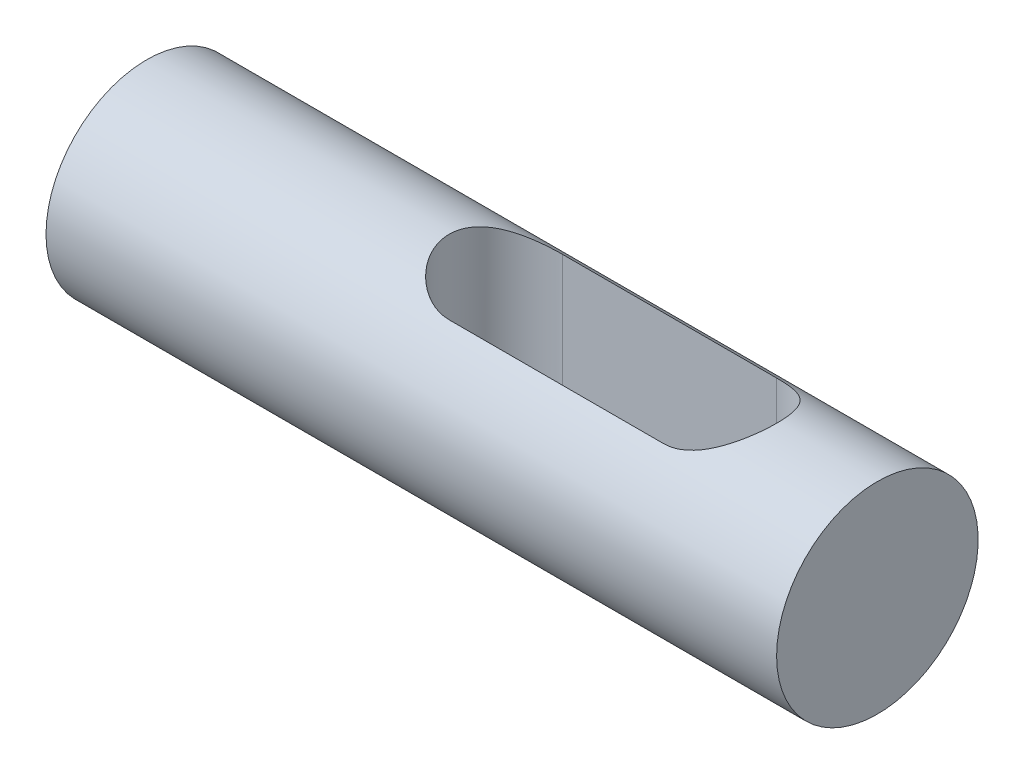
ISO-10303-21;
HEADER;
FILE_DESCRIPTION(('STEP AP214'),'2;1');
FILE_NAME('part.step','',(''),(''),'','','');
FILE_SCHEMA(('AUTOMOTIVE_DESIGN { 1 0 10303 214 1 1 1 1 }'));
ENDSEC;
DATA;
#1=APPLICATION_CONTEXT('core data for automotive mechanical design processes');
#2=APPLICATION_PROTOCOL_DEFINITION('international standard','automotive_design',2000,#1);
#3=PRODUCT_CONTEXT('',#1,'mechanical');
#4=PRODUCT('Part','Part','',(#3));
#5=PRODUCT_RELATED_PRODUCT_CATEGORY('part','',(#4));
#6=PRODUCT_DEFINITION_FORMATION('','',#4);
#7=PRODUCT_DEFINITION_CONTEXT('part definition',#1,'design');
#8=PRODUCT_DEFINITION('design','',#6,#7);
#9=PRODUCT_DEFINITION_SHAPE('','',#8);
#10=(LENGTH_UNIT() NAMED_UNIT(*) SI_UNIT(.MILLI.,.METRE.));
#11=(NAMED_UNIT(*) PLANE_ANGLE_UNIT() SI_UNIT($,.RADIAN.));
#12=(NAMED_UNIT(*) SI_UNIT($,.STERADIAN.) SOLID_ANGLE_UNIT());
#13=UNCERTAINTY_MEASURE_WITH_UNIT(LENGTH_MEASURE(1.E-05),#10,'distance_accuracy_value','');
#14=(GEOMETRIC_REPRESENTATION_CONTEXT(3) GLOBAL_UNCERTAINTY_ASSIGNED_CONTEXT((#13)) GLOBAL_UNIT_ASSIGNED_CONTEXT((#10,
#11,#12)) REPRESENTATION_CONTEXT('',''));
#15=CARTESIAN_POINT('',(0.,0.,0.));
#16=DIRECTION('',(0.,0.,1.));
#17=DIRECTION('',(1.,0.,0.));
#18=AXIS2_PLACEMENT_3D('',#15,#16,#17);
#19=CARTESIAN_POINT('',(-7.25,0.,-2.));
#20=DIRECTION('',(1.,0.,0.));
#21=DIRECTION('',(0.,0.,-1.));
#22=AXIS2_PLACEMENT_3D('',#19,#20,#21);
#23=PLANE('',#22);
#24=CARTESIAN_POINT('',(-7.25,0.,0.));
#25=DIRECTION('',(-1.,0.,0.));
#26=DIRECTION('',(0.,0.,1.));
#27=AXIS2_PLACEMENT_3D('',#24,#25,#26);
#28=CIRCLE('',#27,2.);
#29=CARTESIAN_POINT('',(-7.25,0.,2.));
#30=VERTEX_POINT('',#29);
#31=EDGE_CURVE('E102',#30,#30,#28,.T.);
#32=ORIENTED_EDGE('',*,*,#31,.T.);
#33=EDGE_LOOP('',(#32));
#34=FACE_BOUND('',#33,.T.);
#35=ADVANCED_FACE('F39',(#34),#23,.F.);
#36=CARTESIAN_POINT('',(7.25,0.,-2.));
#37=DIRECTION('',(-1.,0.,0.));
#38=DIRECTION('',(0.,0.,1.));
#39=AXIS2_PLACEMENT_3D('',#36,#37,#38);
#40=PLANE('',#39);
#41=CARTESIAN_POINT('',(7.25,0.,0.));
#42=DIRECTION('',(-1.,0.,0.));
#43=DIRECTION('',(0.,0.,1.));
#44=AXIS2_PLACEMENT_3D('',#41,#42,#43);
#45=CIRCLE('',#44,2.);
#46=CARTESIAN_POINT('',(7.25,0.,2.));
#47=VERTEX_POINT('',#46);
#48=EDGE_CURVE('E98',#47,#47,#45,.T.);
#49=ORIENTED_EDGE('',*,*,#48,.F.);
#50=EDGE_LOOP('',(#49));
#51=FACE_BOUND('',#50,.T.);
#52=ADVANCED_FACE('F146',(#51),#40,.F.);
#53=CARTESIAN_POINT('',(-7.25,0.,0.));
#54=DIRECTION('',(-1.,0.,0.));
#55=DIRECTION('',(0.,0.,1.));
#56=AXIS2_PLACEMENT_3D('',#53,#54,#55);
#57=CYLINDRICAL_SURFACE('',#56,2.);
#58=DIRECTION('',(-1.,0.,0.));
#59=VECTOR('',#58,1.);
#60=CARTESIAN_POINT('',(-7.25,-1.65359456941537,1.125));
#61=LINE('',#60,#59);
#62=CARTESIAN_POINT('',(-0.125000000000001,-1.65359456941537,1.125));
#63=VERTEX_POINT('',#62);
#64=CARTESIAN_POINT('',(4.125,-1.65359456941537,1.125));
#65=VERTEX_POINT('',#64);
#66=EDGE_CURVE('E11',#63,#65,#61,.F.);
#67=ORIENTED_EDGE('',*,*,#66,.T.);
#68=CARTESIAN_POINT('',(4.125,-1.65359456941537,1.125));
#69=CARTESIAN_POINT('',(4.15386389570559,-1.65358711538158,1.12500287836741));
#70=CARTESIAN_POINT('',(4.18271026785527,-1.65435122032378,1.12388845882558));
#71=CARTESIAN_POINT('',(4.24013379992399,-1.65735152559333,1.11946281329818));
#72=CARTESIAN_POINT('',(4.26871116102577,-1.65958651945046,1.11615338770954));
#73=CARTESIAN_POINT('',(4.35331043182428,-1.6683468674762,1.10305603715231));
#74=CARTESIAN_POINT('',(4.40866363768011,-1.67692987515379,1.0900976447495));
#75=CARTESIAN_POINT('',(4.51582344307037,-1.698337951532,1.05642678896663));
#76=CARTESIAN_POINT('',(4.56763974386999,-1.71115080346554,1.03573663425074));
#77=CARTESIAN_POINT('',(4.66714499252839,-1.73954491806023,0.987305391097616));
#78=CARTESIAN_POINT('',(4.7148254994319,-1.7551316531166,0.959550317340254));
#79=CARTESIAN_POINT('',(4.81011548124933,-1.78929411228828,0.894380380741773));
#80=CARTESIAN_POINT('',(4.8571887113898,-1.80801174752583,0.856256062935797));
#81=CARTESIAN_POINT('',(4.94469617247539,-1.84518502966431,0.772901175612199));
#82=CARTESIAN_POINT('',(4.98512824283417,-1.8636405895267,0.727668302777425));
#83=CARTESIAN_POINT('',(5.06185527330172,-1.90021925704792,0.626355454791834));
#84=CARTESIAN_POINT('',(5.09743693517986,-1.91815863765017,0.569662512765784));
#85=CARTESIAN_POINT('',(5.15830643510674,-1.94972275541321,0.449893051164455));
#86=CARTESIAN_POINT('',(5.18360219947783,-1.96335081307874,0.386821493939291));
#87=CARTESIAN_POINT('',(5.22087484964285,-1.983707483721,0.261841154752704));
#88=CARTESIAN_POINT('',(5.23381225144723,-1.99092976310293,0.200301211044951));
#89=CARTESIAN_POINT('',(5.2492153625028,-1.99954794380485,0.0755387572435754));
#90=CARTESIAN_POINT('',(5.25168933581894,-2.00094844317905,0.0123176146996819));
#91=CARTESIAN_POINT('',(5.24634573901463,-1.99794650648411,-0.106573644593671));
#92=CARTESIAN_POINT('',(5.23962433568443,-1.9941620829804,-0.16231326660962));
#93=CARTESIAN_POINT('',(5.218115786903,-1.98222024885811,-0.271718473247412));
#94=CARTESIAN_POINT('',(5.20332813985648,-1.97406256629116,-0.325383928665992));
#95=CARTESIAN_POINT('',(5.16613765736499,-1.95399487456054,-0.429841252362607));
#96=CARTESIAN_POINT('',(5.14366221460192,-1.94204917096166,-0.480600127271722));
#97=CARTESIAN_POINT('',(5.09190207949874,-1.91540667029966,-0.577716666433138));
#98=CARTESIAN_POINT('',(5.06261532716285,-1.90070904121361,-0.624072993204179));
#99=CARTESIAN_POINT('',(4.99437674105676,-1.86793927615096,-0.716567233240053));
#100=CARTESIAN_POINT('',(4.95471348834761,-1.84967367969735,-0.762111612248061));
#101=CARTESIAN_POINT('',(4.86869299929254,-1.81271733895772,-0.846270194651875));
#102=CARTESIAN_POINT('',(4.82232695078998,-1.79402606271729,-0.884875122483921));
#103=CARTESIAN_POINT('',(4.71892944275544,-1.75630121518769,-0.957729032831986));
#104=CARTESIAN_POINT('',(4.66130254430552,-1.73740500124644,-0.991211472146748));
#105=CARTESIAN_POINT('',(4.54010777305908,-1.7039147244886,-1.04773887480402));
#106=CARTESIAN_POINT('',(4.47655860496576,-1.68930768352114,-1.0708154400995));
#107=CARTESIAN_POINT('',(4.36480856074422,-1.67028013150757,-1.100174536906));
#108=CARTESIAN_POINT('',(4.31767277527658,-1.66412149730692,-1.10941178532545));
#109=CARTESIAN_POINT('',(4.22205715091862,-1.65573434723787,-1.12185619841346));
#110=CARTESIAN_POINT('',(4.17357212449972,-1.65352405019902,-1.12503541394649));
#111=CARTESIAN_POINT('',(4.125,-1.65359456941537,-1.125));
#112=B_SPLINE_CURVE_WITH_KNOTS('',3,(#68,#69,#70,#71,#72,#73,#74,#75,#76,#77,#78,#79,#80,#81,
#82,#83,#84,#85,#86,#87,#88,#89,#90,#91,#92,#93,#94,#95,#96,#97,#98,#99,#100,#101,#102,#103,
#104,#105,#106,#107,#108,#109,#110,#111),.UNSPECIFIED.,.F.,.F.,(4,2,2,2,2,2,2,2,2,2,2,2,2,2,2,2,
2,2,2,2,2,4),(0.,0.08652719230841,0.172983500548472,0.344524638880623,0.515574599230706,
0.686965830140966,0.876405902523249,1.06590748440291,1.27268671214241,1.47930629225317,
1.66810632929641,1.85675722330539,2.02477200534607,2.1927972364922,2.36245532435152,
2.53216479006594,2.72068185125432,2.90944904838971,3.11621878001185,3.32235626520317,
3.46710633524031,3.61252261753081),.UNSPECIFIED.);
#113=CARTESIAN_POINT('',(4.125,-1.65359456941537,-1.125));
#114=VERTEX_POINT('',#113);
#115=EDGE_CURVE('E53',#65,#114,#112,.T.);
#116=ORIENTED_EDGE('',*,*,#115,.T.);
#117=DIRECTION('',(-1.,0.,0.));
#118=VECTOR('',#117,1.);
#119=CARTESIAN_POINT('',(-7.25,-1.65359456941537,-1.125));
#120=LINE('',#119,#118);
#121=CARTESIAN_POINT('',(-0.125000000000001,-1.65359456941537,-1.125));
#122=VERTEX_POINT('',#121);
#123=EDGE_CURVE('E130',#114,#122,#120,.T.);
#124=ORIENTED_EDGE('',*,*,#123,.T.);
#125=CARTESIAN_POINT('',(-0.125000000000001,-1.65359456941537,-1.125));
#126=CARTESIAN_POINT('',(-0.153863895705595,-1.65358711538158,-1.12500287836741));
#127=CARTESIAN_POINT('',(-0.182710267855268,-1.65435122032378,-1.12388845882558));
#128=CARTESIAN_POINT('',(-0.240133799923988,-1.65735152559333,-1.11946281329818));
#129=CARTESIAN_POINT('',(-0.268711161025767,-1.65958651945046,-1.11615338770954));
#130=CARTESIAN_POINT('',(-0.353310431824283,-1.6683468674762,-1.10305603715231));
#131=CARTESIAN_POINT('',(-0.408663637680112,-1.67692987515379,-1.0900976447495));
#132=CARTESIAN_POINT('',(-0.515823443070372,-1.698337951532,-1.05642678896663));
#133=CARTESIAN_POINT('',(-0.567639743869989,-1.71115080346554,-1.03573663425074));
#134=CARTESIAN_POINT('',(-0.667144992528395,-1.73954491806023,-0.987305391097617));
#135=CARTESIAN_POINT('',(-0.714825499431905,-1.7551316531166,-0.959550317340254));
#136=CARTESIAN_POINT('',(-0.810115481249332,-1.78929411228828,-0.894380380741774));
#137=CARTESIAN_POINT('',(-0.857188711389803,-1.80801174752583,-0.856256062935797));
#138=CARTESIAN_POINT('',(-0.944696172475388,-1.84518502966431,-0.772901175612199));
#139=CARTESIAN_POINT('',(-0.985128242834172,-1.8636405895267,-0.727668302777425));
#140=CARTESIAN_POINT('',(-1.06185527330172,-1.90021925704792,-0.626355454791835));
#141=CARTESIAN_POINT('',(-1.09743693517986,-1.91815863765017,-0.569662512765785));
#142=CARTESIAN_POINT('',(-1.15830643510674,-1.94972275541321,-0.449893051164457));
#143=CARTESIAN_POINT('',(-1.18360219947783,-1.96335081307874,-0.386821493939293));
#144=CARTESIAN_POINT('',(-1.22087484964285,-1.983707483721,-0.261841154752705));
#145=CARTESIAN_POINT('',(-1.23381225144724,-1.99092976310293,-0.200301211044952));
#146=CARTESIAN_POINT('',(-1.2492153625028,-1.99954794380485,-0.0755387572435765));
#147=CARTESIAN_POINT('',(-1.25168933581894,-2.00094844317905,-0.0123176146996831));
#148=CARTESIAN_POINT('',(-1.24634573901463,-1.99794650648411,0.106573644593669));
#149=CARTESIAN_POINT('',(-1.23962433568444,-1.9941620829804,0.162313266609619));
#150=CARTESIAN_POINT('',(-1.218115786903,-1.98222024885811,0.27171847324741));
#151=CARTESIAN_POINT('',(-1.20332813985648,-1.97406256629116,0.325383928665991));
#152=CARTESIAN_POINT('',(-1.16613765736499,-1.95399487456054,0.429841252362606));
#153=CARTESIAN_POINT('',(-1.14366221460192,-1.94204917096166,0.480600127271721));
#154=CARTESIAN_POINT('',(-1.09190207949875,-1.91540667029966,0.577716666433136));
#155=CARTESIAN_POINT('',(-1.06261532716285,-1.90070904121361,0.624072993204178));
#156=CARTESIAN_POINT('',(-0.994376741056759,-1.86793927615096,0.716567233240052));
#157=CARTESIAN_POINT('',(-0.954713488347611,-1.84967367969735,0.762111612248061));
#158=CARTESIAN_POINT('',(-0.868692999292548,-1.81271733895772,0.846270194651874));
#159=CARTESIAN_POINT('',(-0.822326950789978,-1.79402606271729,0.88487512248392));
#160=CARTESIAN_POINT('',(-0.718929442755448,-1.75630121518769,0.957729032831985));
#161=CARTESIAN_POINT('',(-0.661302544305521,-1.73740500124644,0.991211472146747));
#162=CARTESIAN_POINT('',(-0.540107773059078,-1.7039147244886,1.04773887480402));
#163=CARTESIAN_POINT('',(-0.476558604965762,-1.68930768352114,1.0708154400995));
#164=CARTESIAN_POINT('',(-0.364808560744227,-1.67028013150757,1.100174536906));
#165=CARTESIAN_POINT('',(-0.317672775276578,-1.66412149730692,1.10941178532545));
#166=CARTESIAN_POINT('',(-0.22205715091862,-1.65573434723787,1.12185619841346));
#167=CARTESIAN_POINT('',(-0.173572124499719,-1.65352405019902,1.12503541394649));
#168=CARTESIAN_POINT('',(-0.125000000000001,-1.65359456941537,1.125));
#169=B_SPLINE_CURVE_WITH_KNOTS('',3,(#125,#126,#127,#128,#129,#130,#131,#132,#133,#134,#135,
#136,#137,#138,#139,#140,#141,#142,#143,#144,#145,#146,#147,#148,#149,#150,#151,#152,#153,#154,
#155,#156,#157,#158,#159,#160,#161,#162,#163,#164,#165,#166,#167,#168),.UNSPECIFIED.,.F.,.F.,(4,
2,2,2,2,2,2,2,2,2,2,2,2,2,2,2,2,2,2,2,2,4),(0.,0.0865271923084093,0.172983500548472,
0.344524638880623,0.515574599230706,0.686965830140967,0.876405902523249,1.06590748440291,
1.27268671214241,1.47930629225316,1.66810632929641,1.85675722330539,2.02477200534606,
2.1927972364922,2.36245532435152,2.53216479006593,2.72068185125432,2.90944904838971,
3.11621878001185,3.32235626520317,3.46710633524031,3.61252261753081),.UNSPECIFIED.);
#170=EDGE_CURVE('E46',#122,#63,#169,.T.);
#171=ORIENTED_EDGE('',*,*,#170,.T.);
#172=EDGE_LOOP('',(#67,#116,#124,#171));
#173=FACE_BOUND('',#172,.T.);
#174=DIRECTION('',(-1.,0.,0.));
#175=VECTOR('',#174,1.);
#176=CARTESIAN_POINT('',(-7.25,1.65359456941537,-1.125));
#177=LINE('',#176,#175);
#178=CARTESIAN_POINT('',(-0.125000000000001,1.65359456941537,-1.125));
#179=VERTEX_POINT('',#178);
#180=CARTESIAN_POINT('',(4.125,1.65359456941537,-1.125));
#181=VERTEX_POINT('',#180);
#182=EDGE_CURVE('E88',#179,#181,#177,.F.);
#183=ORIENTED_EDGE('',*,*,#182,.T.);
#184=CARTESIAN_POINT('',(4.125,1.65359456941537,-1.125));
#185=CARTESIAN_POINT('',(4.15386389570559,1.65358711538158,-1.12500287836741));
#186=CARTESIAN_POINT('',(4.18271026785527,1.65435122032378,-1.12388845882558));
#187=CARTESIAN_POINT('',(4.24013379992399,1.65735152559333,-1.11946281329818));
#188=CARTESIAN_POINT('',(4.26871116102577,1.65958651945046,-1.11615338770954));
#189=CARTESIAN_POINT('',(4.35331043182428,1.6683468674762,-1.10305603715231));
#190=CARTESIAN_POINT('',(4.40866363768011,1.67692987515379,-1.0900976447495));
#191=CARTESIAN_POINT('',(4.51582344307037,1.698337951532,-1.05642678896663));
#192=CARTESIAN_POINT('',(4.56763974386999,1.71115080346554,-1.03573663425074));
#193=CARTESIAN_POINT('',(4.66714499252839,1.73954491806023,-0.987305391097616));
#194=CARTESIAN_POINT('',(4.7148254994319,1.7551316531166,-0.959550317340254));
#195=CARTESIAN_POINT('',(4.81011548124933,1.78929411228828,-0.894380380741774));
#196=CARTESIAN_POINT('',(4.8571887113898,1.80801174752583,-0.856256062935797));
#197=CARTESIAN_POINT('',(4.94469617247539,1.84518502966431,-0.772901175612199));
#198=CARTESIAN_POINT('',(4.98512824283417,1.8636405895267,-0.727668302777425));
#199=CARTESIAN_POINT('',(5.06185527330172,1.90021925704792,-0.626355454791834));
#200=CARTESIAN_POINT('',(5.09743693517986,1.91815863765017,-0.569662512765784));
#201=CARTESIAN_POINT('',(5.15830643510674,1.94972275541321,-0.449893051164456));
#202=CARTESIAN_POINT('',(5.18360219947783,1.96335081307874,-0.386821493939292));
#203=CARTESIAN_POINT('',(5.22087484964285,1.983707483721,-0.261841154752705));
#204=CARTESIAN_POINT('',(5.23381225144723,1.99092976310293,-0.200301211044952));
#205=CARTESIAN_POINT('',(5.2492153625028,1.99954794380485,-0.0755387572435762));
#206=CARTESIAN_POINT('',(5.25168933581894,2.00094844317905,-0.0123176146996827));
#207=CARTESIAN_POINT('',(5.24634573901463,1.99794650648411,0.10657364459367));
#208=CARTESIAN_POINT('',(5.23962433568443,1.9941620829804,0.16231326660962));
#209=CARTESIAN_POINT('',(5.218115786903,1.98222024885811,0.271718473247411));
#210=CARTESIAN_POINT('',(5.20332813985648,1.97406256629116,0.325383928665991));
#211=CARTESIAN_POINT('',(5.16613765736499,1.95399487456054,0.429841252362606));
#212=CARTESIAN_POINT('',(5.14366221460192,1.94204917096166,0.480600127271721));
#213=CARTESIAN_POINT('',(5.09190207949874,1.91540667029966,0.577716666433137));
#214=CARTESIAN_POINT('',(5.06261532716285,1.90070904121361,0.624072993204178));
#215=CARTESIAN_POINT('',(4.99437674105676,1.86793927615096,0.716567233240052));
#216=CARTESIAN_POINT('',(4.95471348834761,1.84967367969735,0.762111612248061));
#217=CARTESIAN_POINT('',(4.86869299929255,1.81271733895772,0.846270194651874));
#218=CARTESIAN_POINT('',(4.82232695078998,1.79402606271729,0.88487512248392));
#219=CARTESIAN_POINT('',(4.71892944275545,1.75630121518769,0.957729032831985));
#220=CARTESIAN_POINT('',(4.66130254430552,1.73740500124644,0.991211472146747));
#221=CARTESIAN_POINT('',(4.54010777305908,1.7039147244886,1.04773887480402));
#222=CARTESIAN_POINT('',(4.47655860496576,1.68930768352114,1.0708154400995));
#223=CARTESIAN_POINT('',(4.36480856074422,1.67028013150757,1.100174536906));
#224=CARTESIAN_POINT('',(4.31767277527658,1.66412149730692,1.10941178532545));
#225=CARTESIAN_POINT('',(4.22205715091862,1.65573434723787,1.12185619841346));
#226=CARTESIAN_POINT('',(4.17357212449972,1.65352405019902,1.12503541394649));
#227=CARTESIAN_POINT('',(4.125,1.65359456941537,1.125));
#228=B_SPLINE_CURVE_WITH_KNOTS('',3,(#184,#185,#186,#187,#188,#189,#190,#191,#192,#193,#194,
#195,#196,#197,#198,#199,#200,#201,#202,#203,#204,#205,#206,#207,#208,#209,#210,#211,#212,#213,
#214,#215,#216,#217,#218,#219,#220,#221,#222,#223,#224,#225,#226,#227),.UNSPECIFIED.,.F.,.F.,(4,
2,2,2,2,2,2,2,2,2,2,2,2,2,2,2,2,2,2,2,2,4),(0.,0.08652719230841,0.172983500548472,
0.344524638880623,0.515574599230706,0.686965830140966,0.876405902523249,1.06590748440291,
1.27268671214241,1.47930629225316,1.66810632929641,1.85675722330539,2.02477200534607,
2.1927972364922,2.36245532435152,2.53216479006593,2.72068185125432,2.90944904838971,
3.11621878001185,3.32235626520317,3.46710633524031,3.61252261753081),.UNSPECIFIED.);
#229=CARTESIAN_POINT('',(4.125,1.65359456941537,1.125));
#230=VERTEX_POINT('',#229);
#231=EDGE_CURVE('E91',#181,#230,#228,.T.);
#232=ORIENTED_EDGE('',*,*,#231,.T.);
#233=DIRECTION('',(-1.,0.,0.));
#234=VECTOR('',#233,1.);
#235=CARTESIAN_POINT('',(-7.25,1.65359456941537,1.125));
#236=LINE('',#235,#234);
#237=CARTESIAN_POINT('',(-0.125000000000001,1.65359456941537,1.125));
#238=VERTEX_POINT('',#237);
#239=EDGE_CURVE('E82',#230,#238,#236,.T.);
#240=ORIENTED_EDGE('',*,*,#239,.T.);
#241=CARTESIAN_POINT('',(-0.125000000000001,1.65359456941537,1.125));
#242=CARTESIAN_POINT('',(-0.153863895705595,1.65358711538158,1.12500287836741));
#243=CARTESIAN_POINT('',(-0.182710267855268,1.65435122032378,1.12388845882557));
#244=CARTESIAN_POINT('',(-0.240133799923988,1.65735152559333,1.11946281329818));
#245=CARTESIAN_POINT('',(-0.268711161025768,1.65958651945046,1.11615338770954));
#246=CARTESIAN_POINT('',(-0.353310431824283,1.6683468674762,1.10305603715231));
#247=CARTESIAN_POINT('',(-0.408663637680112,1.67692987515379,1.0900976447495));
#248=CARTESIAN_POINT('',(-0.515823443070372,1.698337951532,1.05642678896663));
#249=CARTESIAN_POINT('',(-0.56763974386999,1.71115080346554,1.03573663425074));
#250=CARTESIAN_POINT('',(-0.667144992528396,1.73954491806023,0.987305391097616));
#251=CARTESIAN_POINT('',(-0.714825499431905,1.7551316531166,0.959550317340254));
#252=CARTESIAN_POINT('',(-0.810115481249332,1.78929411228828,0.894380380741773));
#253=CARTESIAN_POINT('',(-0.857188711389803,1.80801174752583,0.856256062935796));
#254=CARTESIAN_POINT('',(-0.944696172475388,1.84518502966431,0.772901175612198));
#255=CARTESIAN_POINT('',(-0.985128242834172,1.8636405895267,0.727668302777425));
#256=CARTESIAN_POINT('',(-1.06185527330172,1.90021925704792,0.626355454791835));
#257=CARTESIAN_POINT('',(-1.09743693517986,1.91815863765017,0.569662512765784));
#258=CARTESIAN_POINT('',(-1.15830643510674,1.94972275541321,0.449893051164456));
#259=CARTESIAN_POINT('',(-1.18360219947783,1.96335081307874,0.386821493939292));
#260=CARTESIAN_POINT('',(-1.22087484964285,1.983707483721,0.261841154752705));
#261=CARTESIAN_POINT('',(-1.23381225144724,1.99092976310293,0.200301211044951));
#262=CARTESIAN_POINT('',(-1.2492153625028,1.99954794380485,0.0755387572435759));
#263=CARTESIAN_POINT('',(-1.25168933581894,2.00094844317905,0.0123176146996826));
#264=CARTESIAN_POINT('',(-1.24634573901463,1.99794650648411,-0.10657364459367));
#265=CARTESIAN_POINT('',(-1.23962433568444,1.9941620829804,-0.16231326660962));
#266=CARTESIAN_POINT('',(-1.218115786903,1.98222024885811,-0.271718473247411));
#267=CARTESIAN_POINT('',(-1.20332813985648,1.97406256629116,-0.325383928665991));
#268=CARTESIAN_POINT('',(-1.16613765736499,1.95399487456054,-0.429841252362606));
#269=CARTESIAN_POINT('',(-1.14366221460192,1.94204917096166,-0.480600127271722));
#270=CARTESIAN_POINT('',(-1.09190207949875,1.91540667029966,-0.577716666433137));
#271=CARTESIAN_POINT('',(-1.06261532716285,1.90070904121361,-0.624072993204179));
#272=CARTESIAN_POINT('',(-0.994376741056758,1.86793927615096,-0.716567233240053));
#273=CARTESIAN_POINT('',(-0.954713488347611,1.84967367969735,-0.762111612248061));
#274=CARTESIAN_POINT('',(-0.868692999292547,1.81271733895772,-0.846270194651875));
#275=CARTESIAN_POINT('',(-0.822326950789977,1.79402606271729,-0.884875122483921));
#276=CARTESIAN_POINT('',(-0.718929442755447,1.75630121518769,-0.957729032831985));
#277=CARTESIAN_POINT('',(-0.661302544305521,1.73740500124644,-0.991211472146748));
#278=CARTESIAN_POINT('',(-0.540107773059078,1.7039147244886,-1.04773887480402));
#279=CARTESIAN_POINT('',(-0.476558604965762,1.68930768352114,-1.0708154400995));
#280=CARTESIAN_POINT('',(-0.364808560744227,1.67028013150757,-1.100174536906));
#281=CARTESIAN_POINT('',(-0.317672775276578,1.66412149730692,-1.10941178532545));
#282=CARTESIAN_POINT('',(-0.22205715091862,1.65573434723787,-1.12185619841346));
#283=CARTESIAN_POINT('',(-0.173572124499719,1.65352405019902,-1.12503541394649));
#284=CARTESIAN_POINT('',(-0.125000000000001,1.65359456941537,-1.125));
#285=B_SPLINE_CURVE_WITH_KNOTS('',3,(#241,#242,#243,#244,#245,#246,#247,#248,#249,#250,#251,
#252,#253,#254,#255,#256,#257,#258,#259,#260,#261,#262,#263,#264,#265,#266,#267,#268,#269,#270,
#271,#272,#273,#274,#275,#276,#277,#278,#279,#280,#281,#282,#283,#284),.UNSPECIFIED.,.F.,.F.,(4,
2,2,2,2,2,2,2,2,2,2,2,2,2,2,2,2,2,2,2,2,4),(0.,0.0865271923084094,0.172983500548472,
0.344524638880623,0.515574599230706,0.686965830140967,0.87640590252325,1.06590748440291,
1.27268671214241,1.47930629225317,1.66810632929641,1.85675722330539,2.02477200534607,
2.1927972364922,2.36245532435152,2.53216479006594,2.72068185125432,2.90944904838971,
3.11621878001185,3.32235626520317,3.46710633524031,3.61252261753081),.UNSPECIFIED.);
#286=EDGE_CURVE('E61',#238,#179,#285,.T.);
#287=ORIENTED_EDGE('',*,*,#286,.T.);
#288=EDGE_LOOP('',(#183,#232,#240,#287));
#289=FACE_BOUND('',#288,.T.);
#290=ORIENTED_EDGE('',*,*,#31,.F.);
#291=EDGE_LOOP('',(#290));
#292=FACE_BOUND('',#291,.T.);
#293=ORIENTED_EDGE('',*,*,#48,.T.);
#294=EDGE_LOOP('',(#293));
#295=FACE_BOUND('',#294,.T.);
#296=ADVANCED_FACE('F96',(#173,#289,#292,#295),#57,.T.);
#297=CARTESIAN_POINT('',(-0.125000000000001,-2.,0.));
#298=DIRECTION('',(0.,1.,0.));
#299=DIRECTION('',(0.,0.,1.));
#300=AXIS2_PLACEMENT_3D('',#297,#298,#299);
#301=CYLINDRICAL_SURFACE('',#300,1.125);
#302=DIRECTION('',(0.,1.,0.));
#303=VECTOR('',#302,1.);
#304=CARTESIAN_POINT('',(-0.125000000000001,-2.,1.125));
#305=LINE('',#304,#303);
#306=EDGE_CURVE('E85',#63,#238,#305,.T.);
#307=ORIENTED_EDGE('',*,*,#306,.F.);
#308=ORIENTED_EDGE('',*,*,#170,.F.);
#309=DIRECTION('',(0.,1.,0.));
#310=VECTOR('',#309,1.);
#311=CARTESIAN_POINT('',(-0.125000000000001,-2.,-1.125));
#312=LINE('',#311,#310);
#313=EDGE_CURVE('E156',#122,#179,#312,.T.);
#314=ORIENTED_EDGE('',*,*,#313,.T.);
#315=ORIENTED_EDGE('',*,*,#286,.F.);
#316=EDGE_LOOP('',(#307,#308,#314,#315));
#317=FACE_BOUND('',#316,.T.);
#318=ADVANCED_FACE('F137',(#317),#301,.F.);
#319=CARTESIAN_POINT('',(-0.125000000000001,-2.,-1.125));
#320=DIRECTION('',(0.,0.,-1.));
#321=DIRECTION('',(-1.,0.,0.));
#322=AXIS2_PLACEMENT_3D('',#319,#320,#321);
#323=PLANE('',#322);
#324=DIRECTION('',(0.,1.,0.));
#325=VECTOR('',#324,1.);
#326=CARTESIAN_POINT('',(4.125,-2.,-1.125));
#327=LINE('',#326,#325);
#328=EDGE_CURVE('E93',#114,#181,#327,.T.);
#329=ORIENTED_EDGE('',*,*,#328,.T.);
#330=ORIENTED_EDGE('',*,*,#182,.F.);
#331=ORIENTED_EDGE('',*,*,#313,.F.);
#332=ORIENTED_EDGE('',*,*,#123,.F.);
#333=EDGE_LOOP('',(#329,#330,#331,#332));
#334=FACE_BOUND('',#333,.T.);
#335=ADVANCED_FACE('F121',(#334),#323,.F.);
#336=CARTESIAN_POINT('',(4.125,-2.,0.));
#337=DIRECTION('',(0.,1.,0.));
#338=DIRECTION('',(0.,0.,1.));
#339=AXIS2_PLACEMENT_3D('',#336,#337,#338);
#340=CYLINDRICAL_SURFACE('',#339,1.125);
#341=ORIENTED_EDGE('',*,*,#328,.F.);
#342=ORIENTED_EDGE('',*,*,#115,.F.);
#343=DIRECTION('',(0.,1.,0.));
#344=VECTOR('',#343,1.);
#345=CARTESIAN_POINT('',(4.125,-2.,1.125));
#346=LINE('',#345,#344);
#347=EDGE_CURVE('E84',#65,#230,#346,.T.);
#348=ORIENTED_EDGE('',*,*,#347,.T.);
#349=ORIENTED_EDGE('',*,*,#231,.F.);
#350=EDGE_LOOP('',(#341,#342,#348,#349));
#351=FACE_BOUND('',#350,.T.);
#352=ADVANCED_FACE('F90',(#351),#340,.F.);
#353=CARTESIAN_POINT('',(-0.125000000000001,-2.,1.125));
#354=DIRECTION('',(0.,0.,1.));
#355=DIRECTION('',(1.,0.,0.));
#356=AXIS2_PLACEMENT_3D('',#353,#354,#355);
#357=PLANE('',#356);
#358=ORIENTED_EDGE('',*,*,#347,.F.);
#359=ORIENTED_EDGE('',*,*,#66,.F.);
#360=ORIENTED_EDGE('',*,*,#306,.T.);
#361=ORIENTED_EDGE('',*,*,#239,.F.);
#362=EDGE_LOOP('',(#358,#359,#360,#361));
#363=FACE_BOUND('',#362,.T.);
#364=ADVANCED_FACE('F83',(#363),#357,.F.);
#365=CLOSED_SHELL('',(#35,#52,#296,#318,#335,#352,#364));
#366=MANIFOLD_SOLID_BREP('B2',#365);
#367=ADVANCED_BREP_SHAPE_REPRESENTATION('',(#18,#366),#14);
#368=SHAPE_DEFINITION_REPRESENTATION(#9,#367);
ENDSEC;
END-ISO-10303-21;
